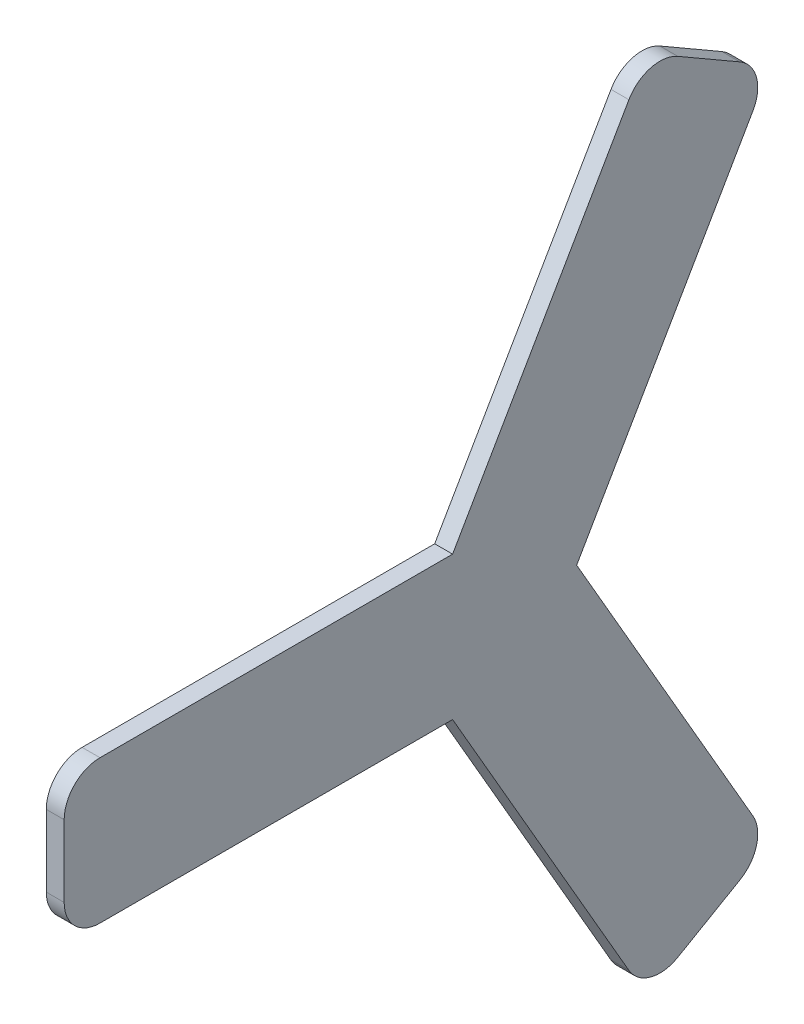
ISO-10303-21;
HEADER;
FILE_DESCRIPTION(('STEP AP214'),'2;1');
FILE_NAME('part.step','',(''),(''),'','','');
FILE_SCHEMA(('AUTOMOTIVE_DESIGN { 1 0 10303 214 1 1 1 1 }'));
ENDSEC;
DATA;
#1=APPLICATION_CONTEXT('core data for automotive mechanical design processes');
#2=APPLICATION_PROTOCOL_DEFINITION('international standard','automotive_design',2000,#1);
#3=PRODUCT_CONTEXT('',#1,'mechanical');
#4=PRODUCT('Part','Part','',(#3));
#5=PRODUCT_RELATED_PRODUCT_CATEGORY('part','',(#4));
#6=PRODUCT_DEFINITION_FORMATION('','',#4);
#7=PRODUCT_DEFINITION_CONTEXT('part definition',#1,'design');
#8=PRODUCT_DEFINITION('design','',#6,#7);
#9=PRODUCT_DEFINITION_SHAPE('','',#8);
#10=(LENGTH_UNIT() NAMED_UNIT(*) SI_UNIT(.MILLI.,.METRE.));
#11=(NAMED_UNIT(*) PLANE_ANGLE_UNIT() SI_UNIT($,.RADIAN.));
#12=(NAMED_UNIT(*) SI_UNIT($,.STERADIAN.) SOLID_ANGLE_UNIT());
#13=UNCERTAINTY_MEASURE_WITH_UNIT(LENGTH_MEASURE(1.E-05),#10,'distance_accuracy_value','');
#14=(GEOMETRIC_REPRESENTATION_CONTEXT(3) GLOBAL_UNCERTAINTY_ASSIGNED_CONTEXT((#13)) GLOBAL_UNIT_ASSIGNED_CONTEXT((#10,
#11,#12)) REPRESENTATION_CONTEXT('',''));
#15=CARTESIAN_POINT('',(0.,0.,0.));
#16=DIRECTION('',(0.,0.,1.));
#17=DIRECTION('',(1.,0.,0.));
#18=AXIS2_PLACEMENT_3D('',#15,#16,#17);
#19=CARTESIAN_POINT('',(0.5,-2.,0.));
#20=DIRECTION('',(0.,-1.,0.));
#21=DIRECTION('',(0.,0.,-1.));
#22=AXIS2_PLACEMENT_3D('',#19,#20,#21);
#23=PLANE('',#22);
#24=DIRECTION('',(0.,0.,1.));
#25=VECTOR('',#24,1.);
#26=CARTESIAN_POINT('',(0.,-2.,0.));
#27=LINE('',#26,#25);
#28=CARTESIAN_POINT('',(0.,-2.,1.15470053837926));
#29=VERTEX_POINT('',#28);
#30=CARTESIAN_POINT('',(0.,-2.,11.));
#31=VERTEX_POINT('',#30);
#32=EDGE_CURVE('E192',#29,#31,#27,.T.);
#33=ORIENTED_EDGE('',*,*,#32,.F.);
#34=DIRECTION('',(1.,0.,0.));
#35=VECTOR('',#34,1.);
#36=CARTESIAN_POINT('',(0.499999999999998,-2.,1.15470053837926));
#37=LINE('',#36,#35);
#38=CARTESIAN_POINT('',(0.499999999999997,-2.,1.15470053837926));
#39=VERTEX_POINT('',#38);
#40=EDGE_CURVE('E182',#29,#39,#37,.T.);
#41=ORIENTED_EDGE('',*,*,#40,.T.);
#42=DIRECTION('',(0.,0.,1.));
#43=VECTOR('',#42,1.);
#44=CARTESIAN_POINT('',(0.5,-2.,0.));
#45=LINE('',#44,#43);
#46=CARTESIAN_POINT('',(0.5,-2.,11.));
#47=VERTEX_POINT('',#46);
#48=EDGE_CURVE('E195',#39,#47,#45,.T.);
#49=ORIENTED_EDGE('',*,*,#48,.T.);
#50=DIRECTION('',(-1.,0.,0.));
#51=VECTOR('',#50,1.);
#52=CARTESIAN_POINT('',(0.5,-2.,11.));
#53=LINE('',#52,#51);
#54=EDGE_CURVE('E197',#47,#31,#53,.T.);
#55=ORIENTED_EDGE('',*,*,#54,.T.);
#56=EDGE_LOOP('',(#33,#41,#49,#55));
#57=FACE_BOUND('',#56,.T.);
#58=ADVANCED_FACE('F39',(#57),#23,.T.);
#59=CARTESIAN_POINT('',(0.5,2.,0.));
#60=DIRECTION('',(0.,-1.,0.));
#61=DIRECTION('',(0.,0.,-1.));
#62=AXIS2_PLACEMENT_3D('',#59,#60,#61);
#63=PLANE('',#62);
#64=DIRECTION('',(0.,0.,1.));
#65=VECTOR('',#64,1.);
#66=CARTESIAN_POINT('',(0.5,2.,0.));
#67=LINE('',#66,#65);
#68=CARTESIAN_POINT('',(0.500000000000003,2.,1.15470053837924));
#69=VERTEX_POINT('',#68);
#70=CARTESIAN_POINT('',(0.5,2.,11.));
#71=VERTEX_POINT('',#70);
#72=EDGE_CURVE('E189',#69,#71,#67,.T.);
#73=ORIENTED_EDGE('',*,*,#72,.F.);
#74=DIRECTION('',(-1.,0.,0.));
#75=VECTOR('',#74,1.);
#76=CARTESIAN_POINT('',(0.500000000000002,2.,1.15470053837925));
#77=LINE('',#76,#75);
#78=CARTESIAN_POINT('',(0.,2.,1.15470053837925));
#79=VERTEX_POINT('',#78);
#80=EDGE_CURVE('E185',#69,#79,#77,.T.);
#81=ORIENTED_EDGE('',*,*,#80,.T.);
#82=DIRECTION('',(0.,0.,1.));
#83=VECTOR('',#82,1.);
#84=CARTESIAN_POINT('',(0.,2.,0.));
#85=LINE('',#84,#83);
#86=CARTESIAN_POINT('',(0.,2.,11.));
#87=VERTEX_POINT('',#86);
#88=EDGE_CURVE('E188',#79,#87,#85,.T.);
#89=ORIENTED_EDGE('',*,*,#88,.T.);
#90=DIRECTION('',(-1.,0.,0.));
#91=VECTOR('',#90,1.);
#92=CARTESIAN_POINT('',(0.5,2.,11.));
#93=LINE('',#92,#91);
#94=EDGE_CURVE('E220',#87,#71,#93,.F.);
#95=ORIENTED_EDGE('',*,*,#94,.T.);
#96=EDGE_LOOP('',(#73,#81,#89,#95));
#97=FACE_BOUND('',#96,.T.);
#98=ADVANCED_FACE('F295',(#97),#63,.F.);
#99=CARTESIAN_POINT('',(0.5,-2.,12.));
#100=DIRECTION('',(0.,0.,1.));
#101=DIRECTION('',(1.,0.,0.));
#102=AXIS2_PLACEMENT_3D('',#99,#100,#101);
#103=PLANE('',#102);
#104=DIRECTION('',(0.,1.,0.));
#105=VECTOR('',#104,1.);
#106=CARTESIAN_POINT('',(0.,-2.,12.));
#107=LINE('',#106,#105);
#108=CARTESIAN_POINT('',(0.,-1.,12.));
#109=VERTEX_POINT('',#108);
#110=CARTESIAN_POINT('',(0.,1.,12.));
#111=VERTEX_POINT('',#110);
#112=EDGE_CURVE('E199',#109,#111,#107,.T.);
#113=ORIENTED_EDGE('',*,*,#112,.F.);
#114=DIRECTION('',(-1.,0.,0.));
#115=VECTOR('',#114,1.);
#116=CARTESIAN_POINT('',(0.5,-1.,12.));
#117=LINE('',#116,#115);
#118=CARTESIAN_POINT('',(0.5,-1.,12.));
#119=VERTEX_POINT('',#118);
#120=EDGE_CURVE('E213',#109,#119,#117,.F.);
#121=ORIENTED_EDGE('',*,*,#120,.T.);
#122=DIRECTION('',(0.,1.,0.));
#123=VECTOR('',#122,1.);
#124=CARTESIAN_POINT('',(0.5,-2.,12.));
#125=LINE('',#124,#123);
#126=CARTESIAN_POINT('',(0.5,1.,12.));
#127=VERTEX_POINT('',#126);
#128=EDGE_CURVE('E191',#119,#127,#125,.T.);
#129=ORIENTED_EDGE('',*,*,#128,.T.);
#130=DIRECTION('',(-1.,0.,0.));
#131=VECTOR('',#130,1.);
#132=CARTESIAN_POINT('',(0.,1.,12.));
#133=LINE('',#132,#131);
#134=EDGE_CURVE('E210',#127,#111,#133,.T.);
#135=ORIENTED_EDGE('',*,*,#134,.T.);
#136=EDGE_LOOP('',(#113,#121,#129,#135));
#137=FACE_BOUND('',#136,.T.);
#138=ADVANCED_FACE('F302',(#137),#103,.T.);
#139=CARTESIAN_POINT('',(0.5,0.,0.));
#140=DIRECTION('',(-1.,0.,0.));
#141=DIRECTION('',(0.,-1.,0.));
#142=AXIS2_PLACEMENT_3D('',#139,#140,#141);
#143=PLANE('',#142);
#144=DIRECTION('',(0.,-0.499999999999992,0.866025403784443));
#145=VECTOR('',#144,1.);
#146=CARTESIAN_POINT('',(0.499999999999994,-9.39230484541334,-7.73205080756879));
#147=LINE('',#146,#145);
#148=CARTESIAN_POINT('',(0.499999999999992,-9.89230484541333,-6.86602540378435));
#149=VERTEX_POINT('',#148);
#150=CARTESIAN_POINT('',(0.49999999999999,-10.8923048454133,-5.13397459621546));
#151=VERTEX_POINT('',#150);
#152=EDGE_CURVE('E252',#149,#151,#147,.T.);
#153=ORIENTED_EDGE('',*,*,#152,.F.);
#154=CARTESIAN_POINT('',(0.5,-9.02627944162889,-6.36602540378436));
#155=DIRECTION('',(-1.,0.,0.));
#156=DIRECTION('',(0.,0.,1.));
#157=AXIS2_PLACEMENT_3D('',#154,#155,#156);
#158=CIRCLE('',#157,1.);
#159=CARTESIAN_POINT('',(0.499999999999994,-8.52627944162889,-7.2320508075688));
#160=VERTEX_POINT('',#159);
#161=EDGE_CURVE('E47',#149,#160,#158,.F.);
#162=ORIENTED_EDGE('',*,*,#161,.T.);
#163=DIRECTION('',(0.,-0.866025403784443,-0.499999999999992));
#164=VECTOR('',#163,1.);
#165=CARTESIAN_POINT('',(0.500000000000003,0.999999999999983,-1.73205080756889));
#166=LINE('',#165,#164);
#167=CARTESIAN_POINT('',(0.500000000000002,0.,-2.3094010767585));
#168=VERTEX_POINT('',#167);
#169=EDGE_CURVE('E167',#168,#160,#166,.T.);
#170=ORIENTED_EDGE('',*,*,#169,.F.);
#171=DIRECTION('',(0.,0.866025403784436,-0.500000000000004));
#172=VECTOR('',#171,1.);
#173=CARTESIAN_POINT('',(0.499999999999997,-1.00000000000001,-1.73205080756887));
#174=LINE('',#173,#172);
#175=CARTESIAN_POINT('',(0.500000000000006,8.5262794416288,-7.23205080756892));
#176=VERTEX_POINT('',#175);
#177=EDGE_CURVE('E166',#168,#176,#174,.T.);
#178=ORIENTED_EDGE('',*,*,#177,.T.);
#179=CARTESIAN_POINT('',(0.5,9.0262794416288,-6.36602540378448));
#180=DIRECTION('',(-1.,0.,0.));
#181=DIRECTION('',(0.,0.,1.));
#182=AXIS2_PLACEMENT_3D('',#179,#180,#181);
#183=CIRCLE('',#182,1.);
#184=CARTESIAN_POINT('',(0.500000000000008,9.89230484541323,-6.86602540378449));
#185=VERTEX_POINT('',#184);
#186=EDGE_CURVE('E234',#176,#185,#183,.F.);
#187=ORIENTED_EDGE('',*,*,#186,.T.);
#188=DIRECTION('',(0.,-0.500000000000004,-0.866025403784436));
#189=VECTOR('',#188,1.);
#190=CARTESIAN_POINT('',(0.500000000000012,11.3923048454132,-4.26794919243118));
#191=LINE('',#190,#189);
#192=CARTESIAN_POINT('',(0.50000000000001,10.8923048454132,-5.13397459621561));
#193=VERTEX_POINT('',#192);
#194=EDGE_CURVE('E266',#193,#185,#191,.T.);
#195=ORIENTED_EDGE('',*,*,#194,.F.);
#196=CARTESIAN_POINT('',(0.5,10.0262794416288,-4.63397459621561));
#197=DIRECTION('',(-1.,0.,0.));
#198=DIRECTION('',(0.,0.,1.));
#199=AXIS2_PLACEMENT_3D('',#196,#197,#198);
#200=CIRCLE('',#199,1.);
#201=CARTESIAN_POINT('',(0.500000000000011,10.5262794416288,-3.76794919243118));
#202=VERTEX_POINT('',#201);
#203=EDGE_CURVE('E236',#193,#202,#200,.F.);
#204=ORIENTED_EDGE('',*,*,#203,.T.);
#205=DIRECTION('',(0.,0.866025403784436,-0.500000000000004));
#206=VECTOR('',#205,1.);
#207=CARTESIAN_POINT('',(0.500000000000003,1.00000000000001,1.73205080756887));
#208=LINE('',#207,#206);
#209=EDGE_CURVE('E177',#69,#202,#208,.T.);
#210=ORIENTED_EDGE('',*,*,#209,.F.);
#211=ORIENTED_EDGE('',*,*,#72,.T.);
#212=CARTESIAN_POINT('',(0.5,1.,11.));
#213=DIRECTION('',(-1.,0.,0.));
#214=DIRECTION('',(0.,0.,1.));
#215=AXIS2_PLACEMENT_3D('',#212,#213,#214);
#216=CIRCLE('',#215,1.);
#217=EDGE_CURVE('E215',#71,#127,#216,.F.);
#218=ORIENTED_EDGE('',*,*,#217,.T.);
#219=ORIENTED_EDGE('',*,*,#128,.F.);
#220=CARTESIAN_POINT('',(0.5,-1.,11.));
#221=DIRECTION('',(-1.,0.,0.));
#222=DIRECTION('',(0.,0.,1.));
#223=AXIS2_PLACEMENT_3D('',#220,#221,#222);
#224=CIRCLE('',#223,1.);
#225=EDGE_CURVE('E217',#119,#47,#224,.F.);
#226=ORIENTED_EDGE('',*,*,#225,.T.);
#227=ORIENTED_EDGE('',*,*,#48,.F.);
#228=DIRECTION('',(0.,-0.866025403784443,-0.499999999999992));
#229=VECTOR('',#228,1.);
#230=CARTESIAN_POINT('',(0.499999999999997,-0.999999999999985,1.73205080756889));
#231=LINE('',#230,#229);
#232=CARTESIAN_POINT('',(0.499999999999989,-10.5262794416289,-3.76794919243103));
#233=VERTEX_POINT('',#232);
#234=EDGE_CURVE('E156',#39,#233,#231,.T.);
#235=ORIENTED_EDGE('',*,*,#234,.T.);
#236=CARTESIAN_POINT('',(0.5,-10.0262794416289,-4.63397459621547));
#237=DIRECTION('',(-1.,0.,0.));
#238=DIRECTION('',(0.,0.,1.));
#239=AXIS2_PLACEMENT_3D('',#236,#237,#238);
#240=CIRCLE('',#239,1.);
#241=EDGE_CURVE('E59',#233,#151,#240,.F.);
#242=ORIENTED_EDGE('',*,*,#241,.T.);
#243=EDGE_LOOP('',(#153,#162,#170,#178,#187,#195,#204,#210,#211,#218,#219,#226,#227,#235,#242));
#244=FACE_BOUND('',#243,.T.);
#245=ADVANCED_FACE('F251',(#244),#143,.F.);
#246=CARTESIAN_POINT('',(0.,0.,0.));
#247=DIRECTION('',(-1.,0.,0.));
#248=DIRECTION('',(0.,-1.,0.));
#249=AXIS2_PLACEMENT_3D('',#246,#247,#248);
#250=PLANE('',#249);
#251=DIRECTION('',(0.,-0.866025403784443,-0.499999999999992));
#252=VECTOR('',#251,1.);
#253=CARTESIAN_POINT('',(0.,0.999999999999984,-1.73205080756889));
#254=LINE('',#253,#252);
#255=CARTESIAN_POINT('',(0.,0.,-2.3094010767585));
#256=VERTEX_POINT('',#255);
#257=CARTESIAN_POINT('',(0.,-8.52627944162889,-7.2320508075688));
#258=VERTEX_POINT('',#257);
#259=EDGE_CURVE('E146',#256,#258,#254,.T.);
#260=ORIENTED_EDGE('',*,*,#259,.T.);
#261=CARTESIAN_POINT('',(0.,-9.02627944162889,-6.36602540378436));
#262=DIRECTION('',(-1.,0.,0.));
#263=DIRECTION('',(0.,0.,1.));
#264=AXIS2_PLACEMENT_3D('',#261,#262,#263);
#265=CIRCLE('',#264,1.);
#266=CARTESIAN_POINT('',(0.,-9.89230484541333,-6.86602540378435));
#267=VERTEX_POINT('',#266);
#268=EDGE_CURVE('E243',#258,#267,#265,.T.);
#269=ORIENTED_EDGE('',*,*,#268,.T.);
#270=DIRECTION('',(0.,-0.499999999999992,0.866025403784443));
#271=VECTOR('',#270,1.);
#272=CARTESIAN_POINT('',(0.,-9.39230484541334,-7.73205080756879));
#273=LINE('',#272,#271);
#274=CARTESIAN_POINT('',(0.,-10.8923048454133,-5.13397459621546));
#275=VERTEX_POINT('',#274);
#276=EDGE_CURVE('E157',#267,#275,#273,.T.);
#277=ORIENTED_EDGE('',*,*,#276,.T.);
#278=CARTESIAN_POINT('',(0.,-10.0262794416289,-4.63397459621547));
#279=DIRECTION('',(-1.,0.,0.));
#280=DIRECTION('',(0.,0.,1.));
#281=AXIS2_PLACEMENT_3D('',#278,#279,#280);
#282=CIRCLE('',#281,1.);
#283=CARTESIAN_POINT('',(0.,-10.5262794416289,-3.76794919243102));
#284=VERTEX_POINT('',#283);
#285=EDGE_CURVE('E241',#275,#284,#282,.T.);
#286=ORIENTED_EDGE('',*,*,#285,.T.);
#287=DIRECTION('',(0.,-0.866025403784443,-0.499999999999992));
#288=VECTOR('',#287,1.);
#289=CARTESIAN_POINT('',(0.,-0.999999999999984,1.73205080756889));
#290=LINE('',#289,#288);
#291=EDGE_CURVE('E262',#29,#284,#290,.T.);
#292=ORIENTED_EDGE('',*,*,#291,.F.);
#293=ORIENTED_EDGE('',*,*,#32,.T.);
#294=CARTESIAN_POINT('',(0.,-1.,11.));
#295=DIRECTION('',(-1.,0.,0.));
#296=DIRECTION('',(0.,0.,1.));
#297=AXIS2_PLACEMENT_3D('',#294,#295,#296);
#298=CIRCLE('',#297,1.);
#299=EDGE_CURVE('E208',#31,#109,#298,.T.);
#300=ORIENTED_EDGE('',*,*,#299,.T.);
#301=ORIENTED_EDGE('',*,*,#112,.T.);
#302=CARTESIAN_POINT('',(0.,1.,11.));
#303=DIRECTION('',(-1.,0.,0.));
#304=DIRECTION('',(0.,0.,1.));
#305=AXIS2_PLACEMENT_3D('',#302,#303,#304);
#306=CIRCLE('',#305,1.);
#307=EDGE_CURVE('E205',#111,#87,#306,.T.);
#308=ORIENTED_EDGE('',*,*,#307,.T.);
#309=ORIENTED_EDGE('',*,*,#88,.F.);
#310=DIRECTION('',(0.,0.866025403784436,-0.500000000000004));
#311=VECTOR('',#310,1.);
#312=CARTESIAN_POINT('',(0.,1.00000000000001,1.73205080756887));
#313=LINE('',#312,#311);
#314=CARTESIAN_POINT('',(0.,10.5262794416288,-3.76794919243118));
#315=VERTEX_POINT('',#314);
#316=EDGE_CURVE('E174',#79,#315,#313,.T.);
#317=ORIENTED_EDGE('',*,*,#316,.T.);
#318=CARTESIAN_POINT('',(0.,10.0262794416288,-4.63397459621561));
#319=DIRECTION('',(-1.,0.,0.));
#320=DIRECTION('',(0.,0.,1.));
#321=AXIS2_PLACEMENT_3D('',#318,#319,#320);
#322=CIRCLE('',#321,1.);
#323=CARTESIAN_POINT('',(0.,10.8923048454132,-5.13397459621561));
#324=VERTEX_POINT('',#323);
#325=EDGE_CURVE('E227',#315,#324,#322,.T.);
#326=ORIENTED_EDGE('',*,*,#325,.T.);
#327=DIRECTION('',(0.,-0.500000000000004,-0.866025403784436));
#328=VECTOR('',#327,1.);
#329=CARTESIAN_POINT('',(0.,11.3923048454132,-4.26794919243118));
#330=LINE('',#329,#328);
#331=CARTESIAN_POINT('',(0.,9.89230484541323,-6.86602540378449));
#332=VERTEX_POINT('',#331);
#333=EDGE_CURVE('E172',#324,#332,#330,.T.);
#334=ORIENTED_EDGE('',*,*,#333,.T.);
#335=CARTESIAN_POINT('',(0.,9.0262794416288,-6.36602540378448));
#336=DIRECTION('',(-1.,0.,0.));
#337=DIRECTION('',(0.,0.,1.));
#338=AXIS2_PLACEMENT_3D('',#335,#336,#337);
#339=CIRCLE('',#338,1.);
#340=CARTESIAN_POINT('',(0.,8.5262794416288,-7.23205080756892));
#341=VERTEX_POINT('',#340);
#342=EDGE_CURVE('E171',#332,#341,#339,.T.);
#343=ORIENTED_EDGE('',*,*,#342,.T.);
#344=DIRECTION('',(0.,0.866025403784436,-0.500000000000004));
#345=VECTOR('',#344,1.);
#346=CARTESIAN_POINT('',(0.,-1.00000000000001,-1.73205080756887));
#347=LINE('',#346,#345);
#348=EDGE_CURVE('E163',#256,#341,#347,.T.);
#349=ORIENTED_EDGE('',*,*,#348,.F.);
#350=EDGE_LOOP('',(#260,#269,#277,#286,#292,#293,#300,#301,#308,#309,#317,#326,#334,#343,#349));
#351=FACE_BOUND('',#350,.T.);
#352=ADVANCED_FACE('F169',(#351),#250,.T.);
#353=CARTESIAN_POINT('',(0.5,-1.,11.));
#354=DIRECTION('',(-1.,0.,0.));
#355=DIRECTION('',(0.,0.,1.));
#356=AXIS2_PLACEMENT_3D('',#353,#354,#355);
#357=CYLINDRICAL_SURFACE('',#356,1.);
#358=ORIENTED_EDGE('',*,*,#225,.F.);
#359=ORIENTED_EDGE('',*,*,#120,.F.);
#360=ORIENTED_EDGE('',*,*,#299,.F.);
#361=ORIENTED_EDGE('',*,*,#54,.F.);
#362=EDGE_LOOP('',(#358,#359,#360,#361));
#363=FACE_BOUND('',#362,.T.);
#364=ADVANCED_FACE('F312',(#363),#357,.T.);
#365=CARTESIAN_POINT('',(0.5,1.,11.));
#366=DIRECTION('',(1.,0.,0.));
#367=DIRECTION('',(0.,0.,-1.));
#368=AXIS2_PLACEMENT_3D('',#365,#366,#367);
#369=CYLINDRICAL_SURFACE('',#368,1.);
#370=ORIENTED_EDGE('',*,*,#217,.F.);
#371=ORIENTED_EDGE('',*,*,#94,.F.);
#372=ORIENTED_EDGE('',*,*,#307,.F.);
#373=ORIENTED_EDGE('',*,*,#134,.F.);
#374=EDGE_LOOP('',(#370,#371,#372,#373));
#375=FACE_BOUND('',#374,.T.);
#376=ADVANCED_FACE('F315',(#375),#369,.T.);
#377=CARTESIAN_POINT('',(0.500000000000003,1.00000000000001,1.73205080756887));
#378=DIRECTION('',(0.,0.500000000000004,0.866025403784436));
#379=DIRECTION('',(0.,-0.866025403784436,0.500000000000004));
#380=AXIS2_PLACEMENT_3D('',#377,#378,#379);
#381=PLANE('',#380);
#382=ORIENTED_EDGE('',*,*,#209,.T.);
#383=DIRECTION('',(-1.,0.,0.));
#384=VECTOR('',#383,1.);
#385=CARTESIAN_POINT('',(0.500000000000011,10.5262794416288,-3.76794919243117));
#386=LINE('',#385,#384);
#387=EDGE_CURVE('E223',#202,#315,#386,.T.);
#388=ORIENTED_EDGE('',*,*,#387,.T.);
#389=ORIENTED_EDGE('',*,*,#316,.F.);
#390=ORIENTED_EDGE('',*,*,#80,.F.);
#391=EDGE_LOOP('',(#382,#388,#389,#390));
#392=FACE_BOUND('',#391,.T.);
#393=ADVANCED_FACE('F275',(#392),#381,.T.);
#394=CARTESIAN_POINT('',(0.499999999999997,-1.00000000000001,-1.73205080756887));
#395=DIRECTION('',(0.,0.500000000000004,0.866025403784436));
#396=DIRECTION('',(0.,-0.866025403784436,0.500000000000004));
#397=AXIS2_PLACEMENT_3D('',#394,#395,#396);
#398=PLANE('',#397);
#399=ORIENTED_EDGE('',*,*,#348,.T.);
#400=DIRECTION('',(-1.,0.,0.));
#401=VECTOR('',#400,1.);
#402=CARTESIAN_POINT('',(0.500000000000006,8.52627944162879,-7.23205080756892));
#403=LINE('',#402,#401);
#404=EDGE_CURVE('E238',#341,#176,#403,.F.);
#405=ORIENTED_EDGE('',*,*,#404,.T.);
#406=ORIENTED_EDGE('',*,*,#177,.F.);
#407=DIRECTION('',(-1.,0.,0.));
#408=VECTOR('',#407,1.);
#409=CARTESIAN_POINT('',(0.5,0.,-2.3094010767585));
#410=LINE('',#409,#408);
#411=EDGE_CURVE('E150',#168,#256,#410,.T.);
#412=ORIENTED_EDGE('',*,*,#411,.T.);
#413=EDGE_LOOP('',(#399,#405,#406,#412));
#414=FACE_BOUND('',#413,.T.);
#415=ADVANCED_FACE('F162',(#414),#398,.F.);
#416=CARTESIAN_POINT('',(0.500000000000012,11.3923048454132,-4.26794919243118));
#417=DIRECTION('',(0.,0.866025403784436,-0.500000000000004));
#418=DIRECTION('',(0.,0.500000000000004,0.866025403784436));
#419=AXIS2_PLACEMENT_3D('',#416,#417,#418);
#420=PLANE('',#419);
#421=ORIENTED_EDGE('',*,*,#333,.F.);
#422=DIRECTION('',(-1.,0.,0.));
#423=VECTOR('',#422,1.);
#424=CARTESIAN_POINT('',(0.50000000000001,10.8923048454132,-5.13397459621561));
#425=LINE('',#424,#423);
#426=EDGE_CURVE('E232',#324,#193,#425,.F.);
#427=ORIENTED_EDGE('',*,*,#426,.T.);
#428=ORIENTED_EDGE('',*,*,#194,.T.);
#429=DIRECTION('',(-1.,0.,0.));
#430=VECTOR('',#429,1.);
#431=CARTESIAN_POINT('',(0.,9.89230484541323,-6.86602540378449));
#432=LINE('',#431,#430);
#433=EDGE_CURVE('E229',#185,#332,#432,.T.);
#434=ORIENTED_EDGE('',*,*,#433,.T.);
#435=EDGE_LOOP('',(#421,#427,#428,#434));
#436=FACE_BOUND('',#435,.T.);
#437=ADVANCED_FACE('F283',(#436),#420,.T.);
#438=CARTESIAN_POINT('',(0.500000000000003,0.999999999999983,-1.73205080756889));
#439=DIRECTION('',(0.,0.499999999999992,-0.866025403784443));
#440=DIRECTION('',(0.,0.866025403784443,0.499999999999992));
#441=AXIS2_PLACEMENT_3D('',#438,#439,#440);
#442=PLANE('',#441);
#443=ORIENTED_EDGE('',*,*,#169,.T.);
#444=DIRECTION('',(-1.,0.,0.));
#445=VECTOR('',#444,1.);
#446=CARTESIAN_POINT('',(0.499999999999994,-8.52627944162889,-7.2320508075688));
#447=LINE('',#446,#445);
#448=EDGE_CURVE('E153',#160,#258,#447,.T.);
#449=ORIENTED_EDGE('',*,*,#448,.T.);
#450=ORIENTED_EDGE('',*,*,#259,.F.);
#451=ORIENTED_EDGE('',*,*,#411,.F.);
#452=EDGE_LOOP('',(#443,#449,#450,#451));
#453=FACE_BOUND('',#452,.T.);
#454=ADVANCED_FACE('F149',(#453),#442,.T.);
#455=CARTESIAN_POINT('',(0.499999999999997,-0.999999999999985,1.73205080756889));
#456=DIRECTION('',(0.,0.499999999999992,-0.866025403784443));
#457=DIRECTION('',(0.,0.866025403784443,0.499999999999992));
#458=AXIS2_PLACEMENT_3D('',#455,#456,#457);
#459=PLANE('',#458);
#460=ORIENTED_EDGE('',*,*,#291,.T.);
#461=DIRECTION('',(-1.,0.,0.));
#462=VECTOR('',#461,1.);
#463=CARTESIAN_POINT('',(0.499999999999989,-10.5262794416289,-3.76794919243103));
#464=LINE('',#463,#462);
#465=EDGE_CURVE('E11',#284,#233,#464,.F.);
#466=ORIENTED_EDGE('',*,*,#465,.T.);
#467=ORIENTED_EDGE('',*,*,#234,.F.);
#468=ORIENTED_EDGE('',*,*,#40,.F.);
#469=EDGE_LOOP('',(#460,#466,#467,#468));
#470=FACE_BOUND('',#469,.T.);
#471=ADVANCED_FACE('F333',(#470),#459,.F.);
#472=CARTESIAN_POINT('',(0.499999999999994,-9.39230484541334,-7.73205080756879));
#473=DIRECTION('',(0.,-0.866025403784443,-0.499999999999992));
#474=DIRECTION('',(0.,0.499999999999992,-0.866025403784443));
#475=AXIS2_PLACEMENT_3D('',#472,#473,#474);
#476=PLANE('',#475);
#477=ORIENTED_EDGE('',*,*,#276,.F.);
#478=DIRECTION('',(-1.,0.,0.));
#479=VECTOR('',#478,1.);
#480=CARTESIAN_POINT('',(0.499999999999992,-9.89230484541333,-6.86602540378435));
#481=LINE('',#480,#479);
#482=EDGE_CURVE('E248',#267,#149,#481,.F.);
#483=ORIENTED_EDGE('',*,*,#482,.T.);
#484=ORIENTED_EDGE('',*,*,#152,.T.);
#485=DIRECTION('',(-1.,0.,0.));
#486=VECTOR('',#485,1.);
#487=CARTESIAN_POINT('',(0.,-10.8923048454133,-5.13397459621546));
#488=LINE('',#487,#486);
#489=EDGE_CURVE('E245',#151,#275,#488,.T.);
#490=ORIENTED_EDGE('',*,*,#489,.T.);
#491=EDGE_LOOP('',(#477,#483,#484,#490));
#492=FACE_BOUND('',#491,.T.);
#493=ADVANCED_FACE('F260',(#492),#476,.T.);
#494=CARTESIAN_POINT('',(0.50000000000001,10.0262794416288,-4.63397459621561));
#495=DIRECTION('',(-1.,0.,0.));
#496=DIRECTION('',(0.,-1.,0.));
#497=AXIS2_PLACEMENT_3D('',#494,#495,#496);
#498=CYLINDRICAL_SURFACE('',#497,1.);
#499=ORIENTED_EDGE('',*,*,#203,.F.);
#500=ORIENTED_EDGE('',*,*,#426,.F.);
#501=ORIENTED_EDGE('',*,*,#325,.F.);
#502=ORIENTED_EDGE('',*,*,#387,.F.);
#503=EDGE_LOOP('',(#499,#500,#501,#502));
#504=FACE_BOUND('',#503,.T.);
#505=ADVANCED_FACE('F279',(#504),#498,.T.);
#506=CARTESIAN_POINT('',(0.500000000000007,9.0262794416288,-6.36602540378448));
#507=DIRECTION('',(1.,0.,0.));
#508=DIRECTION('',(0.,1.,0.));
#509=AXIS2_PLACEMENT_3D('',#506,#507,#508);
#510=CYLINDRICAL_SURFACE('',#509,1.);
#511=ORIENTED_EDGE('',*,*,#186,.F.);
#512=ORIENTED_EDGE('',*,*,#404,.F.);
#513=ORIENTED_EDGE('',*,*,#342,.F.);
#514=ORIENTED_EDGE('',*,*,#433,.F.);
#515=EDGE_LOOP('',(#511,#512,#513,#514));
#516=FACE_BOUND('',#515,.T.);
#517=ADVANCED_FACE('F286',(#516),#510,.T.);
#518=CARTESIAN_POINT('',(0.499999999999993,-9.02627944162889,-6.36602540378436));
#519=DIRECTION('',(-1.,0.,0.));
#520=DIRECTION('',(0.,-1.,0.));
#521=AXIS2_PLACEMENT_3D('',#518,#519,#520);
#522=CYLINDRICAL_SURFACE('',#521,1.);
#523=ORIENTED_EDGE('',*,*,#161,.F.);
#524=ORIENTED_EDGE('',*,*,#482,.F.);
#525=ORIENTED_EDGE('',*,*,#268,.F.);
#526=ORIENTED_EDGE('',*,*,#448,.F.);
#527=EDGE_LOOP('',(#523,#524,#525,#526));
#528=FACE_BOUND('',#527,.T.);
#529=ADVANCED_FACE('F256',(#528),#522,.T.);
#530=CARTESIAN_POINT('',(0.49999999999999,-10.0262794416289,-4.63397459621547));
#531=DIRECTION('',(1.,0.,0.));
#532=DIRECTION('',(0.,1.,0.));
#533=AXIS2_PLACEMENT_3D('',#530,#531,#532);
#534=CYLINDRICAL_SURFACE('',#533,1.);
#535=ORIENTED_EDGE('',*,*,#241,.F.);
#536=ORIENTED_EDGE('',*,*,#465,.F.);
#537=ORIENTED_EDGE('',*,*,#285,.F.);
#538=ORIENTED_EDGE('',*,*,#489,.F.);
#539=EDGE_LOOP('',(#535,#536,#537,#538));
#540=FACE_BOUND('',#539,.T.);
#541=ADVANCED_FACE('F41',(#540),#534,.T.);
#542=CLOSED_SHELL('',(#58,#98,#138,#245,#352,#364,#376,#393,#415,#437,#454,#471,#493,#505,#517,
#529,#541));
#543=MANIFOLD_SOLID_BREP('B2',#542);
#544=ADVANCED_BREP_SHAPE_REPRESENTATION('',(#18,#543),#14);
#545=SHAPE_DEFINITION_REPRESENTATION(#9,#544);
ENDSEC;
END-ISO-10303-21;
